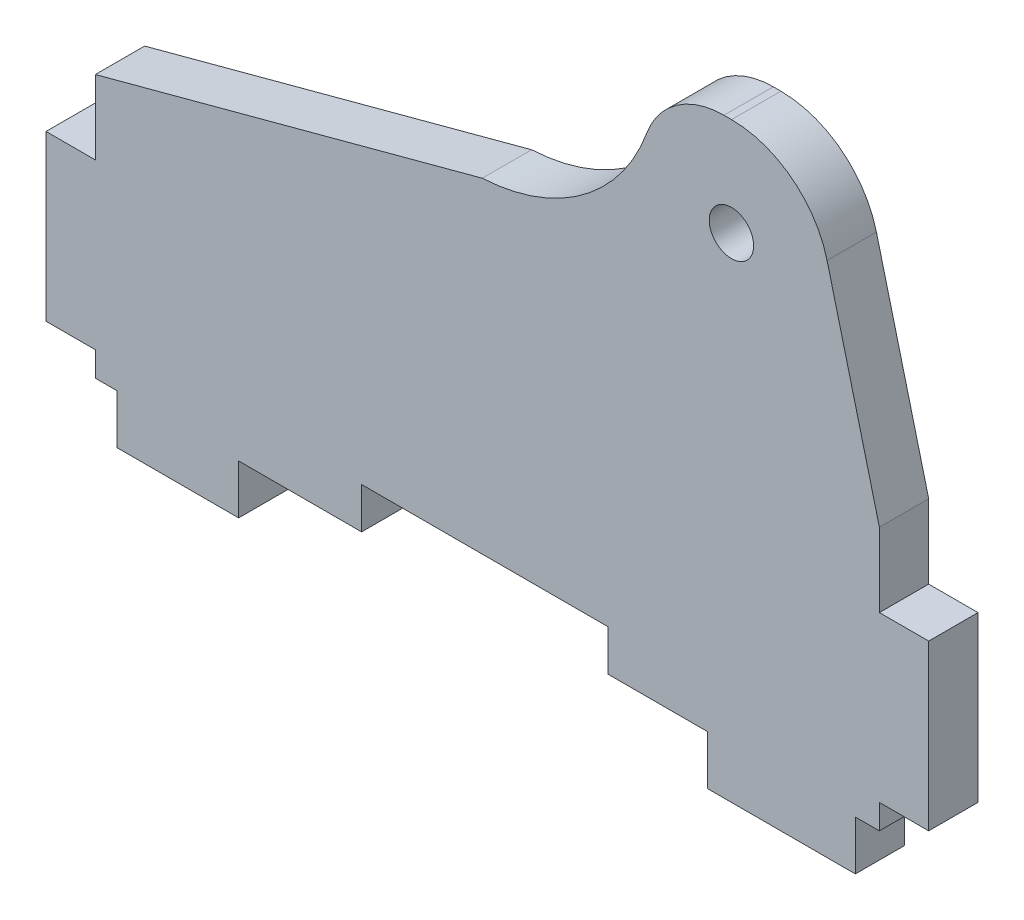
ISO-10303-21;
HEADER;
FILE_DESCRIPTION(('STEP AP214'),'2;1');
FILE_NAME('part.step','',(''),(''),'','','');
FILE_SCHEMA(('AUTOMOTIVE_DESIGN { 1 0 10303 214 1 1 1 1 }'));
ENDSEC;
DATA;
#1=APPLICATION_CONTEXT('core data for automotive mechanical design processes');
#2=APPLICATION_PROTOCOL_DEFINITION('international standard','automotive_design',2000,#1);
#3=PRODUCT_CONTEXT('',#1,'mechanical');
#4=PRODUCT('Part','Part','',(#3));
#5=PRODUCT_RELATED_PRODUCT_CATEGORY('part','',(#4));
#6=PRODUCT_DEFINITION_FORMATION('','',#4);
#7=PRODUCT_DEFINITION_CONTEXT('part definition',#1,'design');
#8=PRODUCT_DEFINITION('design','',#6,#7);
#9=PRODUCT_DEFINITION_SHAPE('','',#8);
#10=(LENGTH_UNIT() NAMED_UNIT(*) SI_UNIT(.MILLI.,.METRE.));
#11=(NAMED_UNIT(*) PLANE_ANGLE_UNIT() SI_UNIT($,.RADIAN.));
#12=(NAMED_UNIT(*) SI_UNIT($,.STERADIAN.) SOLID_ANGLE_UNIT());
#13=UNCERTAINTY_MEASURE_WITH_UNIT(LENGTH_MEASURE(1.E-05),#10,'distance_accuracy_value','');
#14=(GEOMETRIC_REPRESENTATION_CONTEXT(3) GLOBAL_UNCERTAINTY_ASSIGNED_CONTEXT((#13)) GLOBAL_UNIT_ASSIGNED_CONTEXT((#10,
#11,#12)) REPRESENTATION_CONTEXT('',''));
#15=CARTESIAN_POINT('',(0.,0.,0.));
#16=DIRECTION('',(0.,0.,1.));
#17=DIRECTION('',(1.,0.,0.));
#18=AXIS2_PLACEMENT_3D('',#15,#16,#17);
#19=CARTESIAN_POINT('',(41.7056658197043,25.4756,3.));
#20=DIRECTION('',(0.,0.,-1.));
#21=DIRECTION('',(-1.,0.,0.));
#22=AXIS2_PLACEMENT_3D('',#19,#20,#21);
#23=CYLINDRICAL_SURFACE('',#22,5.99999999999999);
#24=CARTESIAN_POINT('',(41.7056658197043,25.4756,0.));
#25=DIRECTION('',(0.,0.,-1.));
#26=DIRECTION('',(-1.,0.,0.));
#27=AXIS2_PLACEMENT_3D('',#24,#25,#26);
#28=CIRCLE('',#27,5.99999999999999);
#29=CARTESIAN_POINT('',(41.7056658197043,31.4756,0.));
#30=VERTEX_POINT('',#29);
#31=CARTESIAN_POINT('',(47.5193202550176,26.9593190120643,0.));
#32=VERTEX_POINT('',#31);
#33=EDGE_CURVE('E260',#30,#32,#28,.T.);
#34=ORIENTED_EDGE('',*,*,#33,.F.);
#35=DIRECTION('',(0.,0.,-1.));
#36=VECTOR('',#35,1.);
#37=CARTESIAN_POINT('',(41.7056658197043,31.4756,3.));
#38=LINE('',#37,#36);
#39=CARTESIAN_POINT('',(41.7056658197043,31.4756,3.));
#40=VERTEX_POINT('',#39);
#41=EDGE_CURVE('E11',#40,#30,#38,.T.);
#42=ORIENTED_EDGE('',*,*,#41,.F.);
#43=CARTESIAN_POINT('',(41.7056658197043,25.4756,3.));
#44=DIRECTION('',(0.,0.,-1.));
#45=DIRECTION('',(-1.,0.,0.));
#46=AXIS2_PLACEMENT_3D('',#43,#44,#45);
#47=CIRCLE('',#46,5.99999999999999);
#48=CARTESIAN_POINT('',(47.5193202550176,26.9593190120643,3.));
#49=VERTEX_POINT('',#48);
#50=EDGE_CURVE('E344',#40,#49,#47,.T.);
#51=ORIENTED_EDGE('',*,*,#50,.T.);
#52=DIRECTION('',(0.,0.,-1.));
#53=VECTOR('',#52,1.);
#54=CARTESIAN_POINT('',(47.5193202550176,26.9593190120643,3.));
#55=LINE('',#54,#53);
#56=EDGE_CURVE('E40',#49,#32,#55,.T.);
#57=ORIENTED_EDGE('',*,*,#56,.T.);
#58=EDGE_LOOP('',(#34,#42,#51,#57));
#59=FACE_BOUND('',#58,.T.);
#60=ADVANCED_FACE('F37',(#59),#23,.T.);
#61=CARTESIAN_POINT('',(41.246222878878,31.4756,3.));
#62=DIRECTION('',(0.,1.,0.));
#63=DIRECTION('',(0.,0.,1.));
#64=AXIS2_PLACEMENT_3D('',#61,#62,#63);
#65=PLANE('',#64);
#66=DIRECTION('',(1.,0.,0.));
#67=VECTOR('',#66,1.);
#68=CARTESIAN_POINT('',(41.246222878878,31.4756,0.));
#69=LINE('',#68,#67);
#70=CARTESIAN_POINT('',(41.246222878878,31.4756,0.));
#71=VERTEX_POINT('',#70);
#72=EDGE_CURVE('E342',#71,#30,#69,.T.);
#73=ORIENTED_EDGE('',*,*,#72,.F.);
#74=DIRECTION('',(0.,0.,-1.));
#75=VECTOR('',#74,1.);
#76=CARTESIAN_POINT('',(41.246222878878,31.4756,3.));
#77=LINE('',#76,#75);
#78=CARTESIAN_POINT('',(41.246222878878,31.4756,3.));
#79=VERTEX_POINT('',#78);
#80=EDGE_CURVE('E46',#79,#71,#77,.T.);
#81=ORIENTED_EDGE('',*,*,#80,.F.);
#82=DIRECTION('',(1.,0.,0.));
#83=VECTOR('',#82,1.);
#84=CARTESIAN_POINT('',(41.246222878878,31.4756,3.));
#85=LINE('',#84,#83);
#86=EDGE_CURVE('E250',#79,#40,#85,.T.);
#87=ORIENTED_EDGE('',*,*,#86,.T.);
#88=ORIENTED_EDGE('',*,*,#41,.T.);
#89=EDGE_LOOP('',(#73,#81,#87,#88));
#90=FACE_BOUND('',#89,.T.);
#91=ADVANCED_FACE('F398',(#90),#65,.T.);
#92=CARTESIAN_POINT('',(41.246222878878,26.4756,3.));
#93=DIRECTION('',(0.,0.,-1.));
#94=DIRECTION('',(-1.,0.,0.));
#95=AXIS2_PLACEMENT_3D('',#92,#93,#94);
#96=CYLINDRICAL_SURFACE('',#95,5.);
#97=CARTESIAN_POINT('',(41.246222878878,26.4756,0.));
#98=DIRECTION('',(0.,0.,-1.));
#99=DIRECTION('',(-1.,0.,0.));
#100=AXIS2_PLACEMENT_3D('',#97,#98,#99);
#101=CIRCLE('',#100,5.);
#102=CARTESIAN_POINT('',(36.5489090063938,28.1888549090451,0.));
#103=VERTEX_POINT('',#102);
#104=EDGE_CURVE('E237',#103,#71,#101,.T.);
#105=ORIENTED_EDGE('',*,*,#104,.F.);
#106=DIRECTION('',(0.,0.,-1.));
#107=VECTOR('',#106,1.);
#108=CARTESIAN_POINT('',(36.5489090063938,28.1888549090451,3.));
#109=LINE('',#108,#107);
#110=CARTESIAN_POINT('',(36.5489090063938,28.1888549090451,3.));
#111=VERTEX_POINT('',#110);
#112=EDGE_CURVE('E232',#111,#103,#109,.T.);
#113=ORIENTED_EDGE('',*,*,#112,.F.);
#114=CARTESIAN_POINT('',(41.246222878878,26.4756,3.));
#115=DIRECTION('',(0.,0.,-1.));
#116=DIRECTION('',(-1.,0.,0.));
#117=AXIS2_PLACEMENT_3D('',#114,#115,#116);
#118=CIRCLE('',#117,5.);
#119=EDGE_CURVE('E235',#111,#79,#118,.T.);
#120=ORIENTED_EDGE('',*,*,#119,.T.);
#121=ORIENTED_EDGE('',*,*,#80,.T.);
#122=EDGE_LOOP('',(#105,#113,#120,#121));
#123=FACE_BOUND('',#122,.T.);
#124=ADVANCED_FACE('F234',(#123),#96,.T.);
#125=CARTESIAN_POINT('',(25.9799527933043,32.0436784543967,3.));
#126=DIRECTION('',(0.,0.,-1.));
#127=DIRECTION('',(-1.,0.,0.));
#128=AXIS2_PLACEMENT_3D('',#125,#126,#127);
#129=CYLINDRICAL_SURFACE('',#128,11.25);
#130=CARTESIAN_POINT('',(25.9799527933043,32.0436784543967,0.));
#131=DIRECTION('',(0.,0.,1.));
#132=DIRECTION('',(1.,0.,0.));
#133=AXIS2_PLACEMENT_3D('',#130,#131,#132);
#134=CIRCLE('',#133,11.25);
#135=CARTESIAN_POINT('',(26.5435430456949,20.807804388379,0.));
#136=VERTEX_POINT('',#135);
#137=EDGE_CURVE('E339',#136,#103,#134,.T.);
#138=ORIENTED_EDGE('',*,*,#137,.F.);
#139=DIRECTION('',(0.,0.,-1.));
#140=VECTOR('',#139,1.);
#141=CARTESIAN_POINT('',(26.5435430456949,20.807804388379,3.));
#142=LINE('',#141,#140);
#143=CARTESIAN_POINT('',(26.5435430456949,20.807804388379,3.));
#144=VERTEX_POINT('',#143);
#145=EDGE_CURVE('E242',#144,#136,#142,.T.);
#146=ORIENTED_EDGE('',*,*,#145,.F.);
#147=CARTESIAN_POINT('',(25.9799527933043,32.0436784543967,3.));
#148=DIRECTION('',(0.,0.,1.));
#149=DIRECTION('',(1.,0.,0.));
#150=AXIS2_PLACEMENT_3D('',#147,#148,#149);
#151=CIRCLE('',#150,11.25);
#152=EDGE_CURVE('E248',#144,#111,#151,.T.);
#153=ORIENTED_EDGE('',*,*,#152,.T.);
#154=ORIENTED_EDGE('',*,*,#112,.T.);
#155=EDGE_LOOP('',(#138,#146,#153,#154));
#156=FACE_BOUND('',#155,.T.);
#157=ADVANCED_FACE('F252',(#156),#129,.F.);
#158=CARTESIAN_POINT('',(3.,14.4996,3.));
#159=DIRECTION('',(-0.258808749652645,0.965928584887741,0.));
#160=DIRECTION('',(-0.965928584887741,-0.258808749652645,0.));
#161=AXIS2_PLACEMENT_3D('',#158,#159,#160);
#162=PLANE('',#161);
#163=DIRECTION('',(0.965928584887741,0.258808749652645,0.));
#164=VECTOR('',#163,1.);
#165=CARTESIAN_POINT('',(3.,14.4996,0.));
#166=LINE('',#165,#164);
#167=CARTESIAN_POINT('',(3.,14.4996,0.));
#168=VERTEX_POINT('',#167);
#169=EDGE_CURVE('E336',#168,#136,#166,.T.);
#170=ORIENTED_EDGE('',*,*,#169,.F.);
#171=DIRECTION('',(0.,0.,-1.));
#172=VECTOR('',#171,1.);
#173=CARTESIAN_POINT('',(3.,14.4996,3.));
#174=LINE('',#173,#172);
#175=CARTESIAN_POINT('',(3.,14.4996,3.));
#176=VERTEX_POINT('',#175);
#177=EDGE_CURVE('E348',#176,#168,#174,.T.);
#178=ORIENTED_EDGE('',*,*,#177,.F.);
#179=DIRECTION('',(0.965928584887741,0.258808749652645,0.));
#180=VECTOR('',#179,1.);
#181=CARTESIAN_POINT('',(3.,14.4996,3.));
#182=LINE('',#181,#180);
#183=EDGE_CURVE('E253',#176,#144,#182,.T.);
#184=ORIENTED_EDGE('',*,*,#183,.T.);
#185=ORIENTED_EDGE('',*,*,#145,.T.);
#186=EDGE_LOOP('',(#170,#178,#184,#185));
#187=FACE_BOUND('',#186,.T.);
#188=ADVANCED_FACE('F411',(#187),#162,.T.);
#189=CARTESIAN_POINT('',(3.,10.0003,3.));
#190=DIRECTION('',(-1.,0.,0.));
#191=DIRECTION('',(0.,0.,1.));
#192=AXIS2_PLACEMENT_3D('',#189,#190,#191);
#193=PLANE('',#192);
#194=DIRECTION('',(0.,1.,0.));
#195=VECTOR('',#194,1.);
#196=CARTESIAN_POINT('',(3.,10.0003,0.));
#197=LINE('',#196,#195);
#198=CARTESIAN_POINT('',(3.,10.0003,0.));
#199=VERTEX_POINT('',#198);
#200=EDGE_CURVE('E333',#199,#168,#197,.T.);
#201=ORIENTED_EDGE('',*,*,#200,.F.);
#202=DIRECTION('',(0.,0.,-1.));
#203=VECTOR('',#202,1.);
#204=CARTESIAN_POINT('',(3.,10.0003,3.));
#205=LINE('',#204,#203);
#206=CARTESIAN_POINT('',(3.,10.0003,3.));
#207=VERTEX_POINT('',#206);
#208=EDGE_CURVE('E350',#207,#199,#205,.T.);
#209=ORIENTED_EDGE('',*,*,#208,.F.);
#210=DIRECTION('',(0.,1.,0.));
#211=VECTOR('',#210,1.);
#212=CARTESIAN_POINT('',(3.,10.0003,3.));
#213=LINE('',#212,#211);
#214=EDGE_CURVE('E255',#207,#176,#213,.T.);
#215=ORIENTED_EDGE('',*,*,#214,.T.);
#216=ORIENTED_EDGE('',*,*,#177,.T.);
#217=EDGE_LOOP('',(#201,#209,#215,#216));
#218=FACE_BOUND('',#217,.T.);
#219=ADVANCED_FACE('F414',(#218),#193,.T.);
#220=CARTESIAN_POINT('',(0.,10.0003,3.));
#221=DIRECTION('',(0.,1.,0.));
#222=DIRECTION('',(0.,0.,1.));
#223=AXIS2_PLACEMENT_3D('',#220,#221,#222);
#224=PLANE('',#223);
#225=DIRECTION('',(1.,0.,0.));
#226=VECTOR('',#225,1.);
#227=CARTESIAN_POINT('',(0.,10.0003,0.));
#228=LINE('',#227,#226);
#229=CARTESIAN_POINT('',(0.,10.0003,0.));
#230=VERTEX_POINT('',#229);
#231=EDGE_CURVE('E330',#230,#199,#228,.T.);
#232=ORIENTED_EDGE('',*,*,#231,.F.);
#233=DIRECTION('',(0.,0.,-1.));
#234=VECTOR('',#233,1.);
#235=CARTESIAN_POINT('',(0.,10.0003,3.));
#236=LINE('',#235,#234);
#237=CARTESIAN_POINT('',(0.,10.0003,3.));
#238=VERTEX_POINT('',#237);
#239=EDGE_CURVE('E352',#238,#230,#236,.T.);
#240=ORIENTED_EDGE('',*,*,#239,.F.);
#241=DIRECTION('',(1.,0.,0.));
#242=VECTOR('',#241,1.);
#243=CARTESIAN_POINT('',(0.,10.0003,3.));
#244=LINE('',#243,#242);
#245=EDGE_CURVE('E596',#238,#207,#244,.T.);
#246=ORIENTED_EDGE('',*,*,#245,.T.);
#247=ORIENTED_EDGE('',*,*,#208,.T.);
#248=EDGE_LOOP('',(#232,#240,#246,#247));
#249=FACE_BOUND('',#248,.T.);
#250=ADVANCED_FACE('F418',(#249),#224,.T.);
#251=CARTESIAN_POINT('',(0.,0.,3.));
#252=DIRECTION('',(-1.,0.,0.));
#253=DIRECTION('',(0.,0.,1.));
#254=AXIS2_PLACEMENT_3D('',#251,#252,#253);
#255=PLANE('',#254);
#256=DIRECTION('',(0.,1.,0.));
#257=VECTOR('',#256,1.);
#258=CARTESIAN_POINT('',(0.,0.,0.));
#259=LINE('',#258,#257);
#260=CARTESIAN_POINT('',(0.,0.,0.));
#261=VERTEX_POINT('',#260);
#262=EDGE_CURVE('E327',#261,#230,#259,.T.);
#263=ORIENTED_EDGE('',*,*,#262,.F.);
#264=DIRECTION('',(0.,0.,-1.));
#265=VECTOR('',#264,1.);
#266=CARTESIAN_POINT('',(0.,0.,3.));
#267=LINE('',#266,#265);
#268=CARTESIAN_POINT('',(0.,0.,3.));
#269=VERTEX_POINT('',#268);
#270=EDGE_CURVE('E354',#269,#261,#267,.T.);
#271=ORIENTED_EDGE('',*,*,#270,.F.);
#272=DIRECTION('',(0.,1.,0.));
#273=VECTOR('',#272,1.);
#274=CARTESIAN_POINT('',(0.,0.,3.));
#275=LINE('',#274,#273);
#276=EDGE_CURVE('E593',#269,#238,#275,.T.);
#277=ORIENTED_EDGE('',*,*,#276,.T.);
#278=ORIENTED_EDGE('',*,*,#239,.T.);
#279=EDGE_LOOP('',(#263,#271,#277,#278));
#280=FACE_BOUND('',#279,.T.);
#281=ADVANCED_FACE('F422',(#280),#255,.T.);
#282=CARTESIAN_POINT('',(3.,0.,3.));
#283=DIRECTION('',(0.,-1.,0.));
#284=DIRECTION('',(0.,0.,-1.));
#285=AXIS2_PLACEMENT_3D('',#282,#283,#284);
#286=PLANE('',#285);
#287=DIRECTION('',(-1.,0.,0.));
#288=VECTOR('',#287,1.);
#289=CARTESIAN_POINT('',(3.,0.,0.));
#290=LINE('',#289,#288);
#291=CARTESIAN_POINT('',(3.,0.,0.));
#292=VERTEX_POINT('',#291);
#293=EDGE_CURVE('E324',#292,#261,#290,.T.);
#294=ORIENTED_EDGE('',*,*,#293,.F.);
#295=DIRECTION('',(0.,0.,-1.));
#296=VECTOR('',#295,1.);
#297=CARTESIAN_POINT('',(3.,0.,3.));
#298=LINE('',#297,#296);
#299=CARTESIAN_POINT('',(3.,0.,3.));
#300=VERTEX_POINT('',#299);
#301=EDGE_CURVE('E356',#300,#292,#298,.T.);
#302=ORIENTED_EDGE('',*,*,#301,.F.);
#303=DIRECTION('',(-1.,0.,0.));
#304=VECTOR('',#303,1.);
#305=CARTESIAN_POINT('',(3.,0.,3.));
#306=LINE('',#305,#304);
#307=EDGE_CURVE('E590',#300,#269,#306,.T.);
#308=ORIENTED_EDGE('',*,*,#307,.T.);
#309=ORIENTED_EDGE('',*,*,#270,.T.);
#310=EDGE_LOOP('',(#294,#302,#308,#309));
#311=FACE_BOUND('',#310,.T.);
#312=ADVANCED_FACE('F426',(#311),#286,.T.);
#313=CARTESIAN_POINT('',(3.,-1.5007,3.));
#314=DIRECTION('',(-1.,0.,0.));
#315=DIRECTION('',(0.,0.,1.));
#316=AXIS2_PLACEMENT_3D('',#313,#314,#315);
#317=PLANE('',#316);
#318=DIRECTION('',(0.,1.,0.));
#319=VECTOR('',#318,1.);
#320=CARTESIAN_POINT('',(3.,-1.5007,0.));
#321=LINE('',#320,#319);
#322=CARTESIAN_POINT('',(3.,-1.5007,0.));
#323=VERTEX_POINT('',#322);
#324=EDGE_CURVE('E321',#323,#292,#321,.T.);
#325=ORIENTED_EDGE('',*,*,#324,.F.);
#326=DIRECTION('',(0.,0.,-1.));
#327=VECTOR('',#326,1.);
#328=CARTESIAN_POINT('',(3.,-1.5007,3.));
#329=LINE('',#328,#327);
#330=CARTESIAN_POINT('',(3.,-1.5007,3.));
#331=VERTEX_POINT('',#330);
#332=EDGE_CURVE('E358',#331,#323,#329,.T.);
#333=ORIENTED_EDGE('',*,*,#332,.F.);
#334=DIRECTION('',(0.,1.,0.));
#335=VECTOR('',#334,1.);
#336=CARTESIAN_POINT('',(3.,-1.5007,3.));
#337=LINE('',#336,#335);
#338=EDGE_CURVE('E587',#331,#300,#337,.T.);
#339=ORIENTED_EDGE('',*,*,#338,.T.);
#340=ORIENTED_EDGE('',*,*,#301,.T.);
#341=EDGE_LOOP('',(#325,#333,#339,#340));
#342=FACE_BOUND('',#341,.T.);
#343=ADVANCED_FACE('F430',(#342),#317,.T.);
#344=CARTESIAN_POINT('',(4.3215,-1.5007,3.));
#345=DIRECTION('',(0.,-1.,0.));
#346=DIRECTION('',(0.,0.,-1.));
#347=AXIS2_PLACEMENT_3D('',#344,#345,#346);
#348=PLANE('',#347);
#349=DIRECTION('',(-1.,0.,0.));
#350=VECTOR('',#349,1.);
#351=CARTESIAN_POINT('',(4.3215,-1.5007,0.));
#352=LINE('',#351,#350);
#353=CARTESIAN_POINT('',(4.3215,-1.5007,0.));
#354=VERTEX_POINT('',#353);
#355=EDGE_CURVE('E318',#354,#323,#352,.T.);
#356=ORIENTED_EDGE('',*,*,#355,.F.);
#357=DIRECTION('',(0.,0.,-1.));
#358=VECTOR('',#357,1.);
#359=CARTESIAN_POINT('',(4.3215,-1.5007,3.));
#360=LINE('',#359,#358);
#361=CARTESIAN_POINT('',(4.3215,-1.5007,3.));
#362=VERTEX_POINT('',#361);
#363=EDGE_CURVE('E360',#362,#354,#360,.T.);
#364=ORIENTED_EDGE('',*,*,#363,.F.);
#365=DIRECTION('',(-1.,0.,0.));
#366=VECTOR('',#365,1.);
#367=CARTESIAN_POINT('',(4.3215,-1.5007,3.));
#368=LINE('',#367,#366);
#369=EDGE_CURVE('E584',#362,#331,#368,.T.);
#370=ORIENTED_EDGE('',*,*,#369,.T.);
#371=ORIENTED_EDGE('',*,*,#332,.T.);
#372=EDGE_LOOP('',(#356,#364,#370,#371));
#373=FACE_BOUND('',#372,.T.);
#374=ADVANCED_FACE('F434',(#373),#348,.T.);
#375=CARTESIAN_POINT('',(4.3215,-4.5007,3.));
#376=DIRECTION('',(-1.,0.,0.));
#377=DIRECTION('',(0.,0.,1.));
#378=AXIS2_PLACEMENT_3D('',#375,#376,#377);
#379=PLANE('',#378);
#380=DIRECTION('',(0.,1.,0.));
#381=VECTOR('',#380,1.);
#382=CARTESIAN_POINT('',(4.3215,-4.5007,0.));
#383=LINE('',#382,#381);
#384=CARTESIAN_POINT('',(4.3215,-4.5007,0.));
#385=VERTEX_POINT('',#384);
#386=EDGE_CURVE('E315',#385,#354,#383,.T.);
#387=ORIENTED_EDGE('',*,*,#386,.F.);
#388=DIRECTION('',(0.,0.,-1.));
#389=VECTOR('',#388,1.);
#390=CARTESIAN_POINT('',(4.3215,-4.5007,3.));
#391=LINE('',#390,#389);
#392=CARTESIAN_POINT('',(4.3215,-4.5007,3.));
#393=VERTEX_POINT('',#392);
#394=EDGE_CURVE('E362',#393,#385,#391,.T.);
#395=ORIENTED_EDGE('',*,*,#394,.F.);
#396=DIRECTION('',(0.,1.,0.));
#397=VECTOR('',#396,1.);
#398=CARTESIAN_POINT('',(4.3215,-4.5007,3.));
#399=LINE('',#398,#397);
#400=EDGE_CURVE('E581',#393,#362,#399,.T.);
#401=ORIENTED_EDGE('',*,*,#400,.T.);
#402=ORIENTED_EDGE('',*,*,#363,.T.);
#403=EDGE_LOOP('',(#387,#395,#401,#402));
#404=FACE_BOUND('',#403,.T.);
#405=ADVANCED_FACE('F438',(#404),#379,.T.);
#406=CARTESIAN_POINT('',(11.7217,-4.5007,3.));
#407=DIRECTION('',(0.,-1.,0.));
#408=DIRECTION('',(0.,0.,-1.));
#409=AXIS2_PLACEMENT_3D('',#406,#407,#408);
#410=PLANE('',#409);
#411=DIRECTION('',(-1.,0.,0.));
#412=VECTOR('',#411,1.);
#413=CARTESIAN_POINT('',(11.7217,-4.5007,0.));
#414=LINE('',#413,#412);
#415=CARTESIAN_POINT('',(11.7217,-4.5007,0.));
#416=VERTEX_POINT('',#415);
#417=EDGE_CURVE('E312',#416,#385,#414,.T.);
#418=ORIENTED_EDGE('',*,*,#417,.F.);
#419=DIRECTION('',(0.,0.,-1.));
#420=VECTOR('',#419,1.);
#421=CARTESIAN_POINT('',(11.7217,-4.5007,3.));
#422=LINE('',#421,#420);
#423=CARTESIAN_POINT('',(11.7217,-4.5007,3.));
#424=VERTEX_POINT('',#423);
#425=EDGE_CURVE('E364',#424,#416,#422,.T.);
#426=ORIENTED_EDGE('',*,*,#425,.F.);
#427=DIRECTION('',(-1.,0.,0.));
#428=VECTOR('',#427,1.);
#429=CARTESIAN_POINT('',(11.7217,-4.5007,3.));
#430=LINE('',#429,#428);
#431=EDGE_CURVE('E578',#424,#393,#430,.T.);
#432=ORIENTED_EDGE('',*,*,#431,.T.);
#433=ORIENTED_EDGE('',*,*,#394,.T.);
#434=EDGE_LOOP('',(#418,#426,#432,#433));
#435=FACE_BOUND('',#434,.T.);
#436=ADVANCED_FACE('F442',(#435),#410,.T.);
#437=CARTESIAN_POINT('',(11.7217,-1.4993,3.));
#438=DIRECTION('',(1.,0.,0.));
#439=DIRECTION('',(0.,1.,0.));
#440=AXIS2_PLACEMENT_3D('',#437,#438,#439);
#441=PLANE('',#440);
#442=DIRECTION('',(0.,-1.,0.));
#443=VECTOR('',#442,1.);
#444=CARTESIAN_POINT('',(11.7217,-1.4993,0.));
#445=LINE('',#444,#443);
#446=CARTESIAN_POINT('',(11.7217,-1.4993,0.));
#447=VERTEX_POINT('',#446);
#448=EDGE_CURVE('E309',#447,#416,#445,.T.);
#449=ORIENTED_EDGE('',*,*,#448,.F.);
#450=DIRECTION('',(0.,0.,-1.));
#451=VECTOR('',#450,1.);
#452=CARTESIAN_POINT('',(11.7217,-1.4993,3.));
#453=LINE('',#452,#451);
#454=CARTESIAN_POINT('',(11.7217,-1.4993,3.));
#455=VERTEX_POINT('',#454);
#456=EDGE_CURVE('E366',#455,#447,#453,.T.);
#457=ORIENTED_EDGE('',*,*,#456,.F.);
#458=DIRECTION('',(0.,-1.,0.));
#459=VECTOR('',#458,1.);
#460=CARTESIAN_POINT('',(11.7217,-1.4993,3.));
#461=LINE('',#460,#459);
#462=EDGE_CURVE('E575',#455,#424,#461,.T.);
#463=ORIENTED_EDGE('',*,*,#462,.T.);
#464=ORIENTED_EDGE('',*,*,#425,.T.);
#465=EDGE_LOOP('',(#449,#457,#463,#464));
#466=FACE_BOUND('',#465,.T.);
#467=ADVANCED_FACE('F446',(#466),#441,.T.);
#468=CARTESIAN_POINT('',(19.2003,-1.4993,3.));
#469=DIRECTION('',(0.,-1.,0.));
#470=DIRECTION('',(0.,0.,-1.));
#471=AXIS2_PLACEMENT_3D('',#468,#469,#470);
#472=PLANE('',#471);
#473=DIRECTION('',(-1.,0.,0.));
#474=VECTOR('',#473,1.);
#475=CARTESIAN_POINT('',(19.2003,-1.4993,0.));
#476=LINE('',#475,#474);
#477=CARTESIAN_POINT('',(19.2003,-1.4993,0.));
#478=VERTEX_POINT('',#477);
#479=EDGE_CURVE('E306',#478,#447,#476,.T.);
#480=ORIENTED_EDGE('',*,*,#479,.F.);
#481=DIRECTION('',(0.,0.,-1.));
#482=VECTOR('',#481,1.);
#483=CARTESIAN_POINT('',(19.2003,-1.4993,3.));
#484=LINE('',#483,#482);
#485=CARTESIAN_POINT('',(19.2003,-1.4993,3.));
#486=VERTEX_POINT('',#485);
#487=EDGE_CURVE('E368',#486,#478,#484,.T.);
#488=ORIENTED_EDGE('',*,*,#487,.F.);
#489=DIRECTION('',(-1.,0.,0.));
#490=VECTOR('',#489,1.);
#491=CARTESIAN_POINT('',(19.2003,-1.4993,3.));
#492=LINE('',#491,#490);
#493=EDGE_CURVE('E572',#486,#455,#492,.T.);
#494=ORIENTED_EDGE('',*,*,#493,.T.);
#495=ORIENTED_EDGE('',*,*,#456,.T.);
#496=EDGE_LOOP('',(#480,#488,#494,#495));
#497=FACE_BOUND('',#496,.T.);
#498=ADVANCED_FACE('F450',(#497),#472,.T.);
#499=CARTESIAN_POINT('',(19.2003,1.0005,3.));
#500=DIRECTION('',(1.,0.,0.));
#501=DIRECTION('',(0.,0.,-1.));
#502=AXIS2_PLACEMENT_3D('',#499,#500,#501);
#503=PLANE('',#502);
#504=DIRECTION('',(0.,-1.,0.));
#505=VECTOR('',#504,1.);
#506=CARTESIAN_POINT('',(19.2003,1.0005,0.));
#507=LINE('',#506,#505);
#508=CARTESIAN_POINT('',(19.2003,1.0005,0.));
#509=VERTEX_POINT('',#508);
#510=EDGE_CURVE('E303',#509,#478,#507,.T.);
#511=ORIENTED_EDGE('',*,*,#510,.F.);
#512=DIRECTION('',(0.,0.,-1.));
#513=VECTOR('',#512,1.);
#514=CARTESIAN_POINT('',(19.2003,1.0005,3.));
#515=LINE('',#514,#513);
#516=CARTESIAN_POINT('',(19.2003,1.0005,3.));
#517=VERTEX_POINT('',#516);
#518=EDGE_CURVE('E370',#517,#509,#515,.T.);
#519=ORIENTED_EDGE('',*,*,#518,.F.);
#520=DIRECTION('',(0.,-1.,0.));
#521=VECTOR('',#520,1.);
#522=CARTESIAN_POINT('',(19.2003,1.0005,3.));
#523=LINE('',#522,#521);
#524=EDGE_CURVE('E569',#517,#486,#523,.T.);
#525=ORIENTED_EDGE('',*,*,#524,.T.);
#526=ORIENTED_EDGE('',*,*,#487,.T.);
#527=EDGE_LOOP('',(#511,#519,#525,#526));
#528=FACE_BOUND('',#527,.T.);
#529=ADVANCED_FACE('F454',(#528),#503,.T.);
#530=CARTESIAN_POINT('',(34.2002,1.0005,3.));
#531=DIRECTION('',(0.,-1.,0.));
#532=DIRECTION('',(0.,0.,-1.));
#533=AXIS2_PLACEMENT_3D('',#530,#531,#532);
#534=PLANE('',#533);
#535=DIRECTION('',(-1.,0.,0.));
#536=VECTOR('',#535,1.);
#537=CARTESIAN_POINT('',(34.2002,1.0005,0.));
#538=LINE('',#537,#536);
#539=CARTESIAN_POINT('',(34.2002,1.0005,0.));
#540=VERTEX_POINT('',#539);
#541=EDGE_CURVE('E300',#540,#509,#538,.T.);
#542=ORIENTED_EDGE('',*,*,#541,.F.);
#543=DIRECTION('',(0.,0.,-1.));
#544=VECTOR('',#543,1.);
#545=CARTESIAN_POINT('',(34.2002,1.0005,3.));
#546=LINE('',#545,#544);
#547=CARTESIAN_POINT('',(34.2002,1.0005,3.));
#548=VERTEX_POINT('',#547);
#549=EDGE_CURVE('E372',#548,#540,#546,.T.);
#550=ORIENTED_EDGE('',*,*,#549,.F.);
#551=DIRECTION('',(-1.,0.,0.));
#552=VECTOR('',#551,1.);
#553=CARTESIAN_POINT('',(34.2002,1.0005,3.));
#554=LINE('',#553,#552);
#555=EDGE_CURVE('E566',#548,#517,#554,.T.);
#556=ORIENTED_EDGE('',*,*,#555,.T.);
#557=ORIENTED_EDGE('',*,*,#518,.T.);
#558=EDGE_LOOP('',(#542,#550,#556,#557));
#559=FACE_BOUND('',#558,.T.);
#560=ADVANCED_FACE('F458',(#559),#534,.T.);
#561=CARTESIAN_POINT('',(34.2002,-1.4993,3.));
#562=DIRECTION('',(-1.,0.,0.));
#563=DIRECTION('',(0.,0.,1.));
#564=AXIS2_PLACEMENT_3D('',#561,#562,#563);
#565=PLANE('',#564);
#566=DIRECTION('',(0.,1.,0.));
#567=VECTOR('',#566,1.);
#568=CARTESIAN_POINT('',(34.2002,-1.4993,0.));
#569=LINE('',#568,#567);
#570=CARTESIAN_POINT('',(34.2002,-1.4993,0.));
#571=VERTEX_POINT('',#570);
#572=EDGE_CURVE('E297',#571,#540,#569,.T.);
#573=ORIENTED_EDGE('',*,*,#572,.F.);
#574=DIRECTION('',(0.,0.,-1.));
#575=VECTOR('',#574,1.);
#576=CARTESIAN_POINT('',(34.2002,-1.4993,3.));
#577=LINE('',#576,#575);
#578=CARTESIAN_POINT('',(34.2002,-1.4993,3.));
#579=VERTEX_POINT('',#578);
#580=EDGE_CURVE('E374',#579,#571,#577,.T.);
#581=ORIENTED_EDGE('',*,*,#580,.F.);
#582=DIRECTION('',(0.,1.,0.));
#583=VECTOR('',#582,1.);
#584=CARTESIAN_POINT('',(34.2002,-1.4993,3.));
#585=LINE('',#584,#583);
#586=EDGE_CURVE('E563',#579,#548,#585,.T.);
#587=ORIENTED_EDGE('',*,*,#586,.T.);
#588=ORIENTED_EDGE('',*,*,#549,.T.);
#589=EDGE_LOOP('',(#573,#581,#587,#588));
#590=FACE_BOUND('',#589,.T.);
#591=ADVANCED_FACE('F462',(#590),#565,.T.);
#592=CARTESIAN_POINT('',(40.2392,-1.4993,3.));
#593=DIRECTION('',(0.,-1.,0.));
#594=DIRECTION('',(0.,0.,-1.));
#595=AXIS2_PLACEMENT_3D('',#592,#593,#594);
#596=PLANE('',#595);
#597=DIRECTION('',(-1.,0.,0.));
#598=VECTOR('',#597,1.);
#599=CARTESIAN_POINT('',(40.2392,-1.4993,0.));
#600=LINE('',#599,#598);
#601=CARTESIAN_POINT('',(40.2392,-1.4993,0.));
#602=VERTEX_POINT('',#601);
#603=EDGE_CURVE('E294',#602,#571,#600,.T.);
#604=ORIENTED_EDGE('',*,*,#603,.F.);
#605=DIRECTION('',(0.,0.,-1.));
#606=VECTOR('',#605,1.);
#607=CARTESIAN_POINT('',(40.2392,-1.4993,3.));
#608=LINE('',#607,#606);
#609=CARTESIAN_POINT('',(40.2392,-1.4993,3.));
#610=VERTEX_POINT('',#609);
#611=EDGE_CURVE('E376',#610,#602,#608,.T.);
#612=ORIENTED_EDGE('',*,*,#611,.F.);
#613=DIRECTION('',(-1.,0.,0.));
#614=VECTOR('',#613,1.);
#615=CARTESIAN_POINT('',(40.2392,-1.4993,3.));
#616=LINE('',#615,#614);
#617=EDGE_CURVE('E560',#610,#579,#616,.T.);
#618=ORIENTED_EDGE('',*,*,#617,.T.);
#619=ORIENTED_EDGE('',*,*,#580,.T.);
#620=EDGE_LOOP('',(#604,#612,#618,#619));
#621=FACE_BOUND('',#620,.T.);
#622=ADVANCED_FACE('F466',(#621),#596,.T.);
#623=CARTESIAN_POINT('',(40.2392,-4.5007,3.));
#624=DIRECTION('',(-1.,0.,0.));
#625=DIRECTION('',(0.,0.,1.));
#626=AXIS2_PLACEMENT_3D('',#623,#624,#625);
#627=PLANE('',#626);
#628=DIRECTION('',(0.,1.,0.));
#629=VECTOR('',#628,1.);
#630=CARTESIAN_POINT('',(40.2392,-4.5007,0.));
#631=LINE('',#630,#629);
#632=CARTESIAN_POINT('',(40.2392,-4.5007,0.));
#633=VERTEX_POINT('',#632);
#634=EDGE_CURVE('E291',#633,#602,#631,.T.);
#635=ORIENTED_EDGE('',*,*,#634,.F.);
#636=DIRECTION('',(0.,0.,-1.));
#637=VECTOR('',#636,1.);
#638=CARTESIAN_POINT('',(40.2392,-4.5007,3.));
#639=LINE('',#638,#637);
#640=CARTESIAN_POINT('',(40.2392,-4.5007,3.));
#641=VERTEX_POINT('',#640);
#642=EDGE_CURVE('E378',#641,#633,#639,.T.);
#643=ORIENTED_EDGE('',*,*,#642,.F.);
#644=DIRECTION('',(0.,1.,0.));
#645=VECTOR('',#644,1.);
#646=CARTESIAN_POINT('',(40.2392,-4.5007,3.));
#647=LINE('',#646,#645);
#648=EDGE_CURVE('E557',#641,#610,#647,.T.);
#649=ORIENTED_EDGE('',*,*,#648,.T.);
#650=ORIENTED_EDGE('',*,*,#611,.T.);
#651=EDGE_LOOP('',(#635,#643,#649,#650));
#652=FACE_BOUND('',#651,.T.);
#653=ADVANCED_FACE('F470',(#652),#627,.T.);
#654=CARTESIAN_POINT('',(49.2382,-4.5007,3.));
#655=DIRECTION('',(0.,-1.,0.));
#656=DIRECTION('',(0.,0.,-1.));
#657=AXIS2_PLACEMENT_3D('',#654,#655,#656);
#658=PLANE('',#657);
#659=DIRECTION('',(-1.,0.,0.));
#660=VECTOR('',#659,1.);
#661=CARTESIAN_POINT('',(49.2382,-4.5007,0.));
#662=LINE('',#661,#660);
#663=CARTESIAN_POINT('',(49.2382,-4.5007,0.));
#664=VERTEX_POINT('',#663);
#665=EDGE_CURVE('E288',#664,#633,#662,.T.);
#666=ORIENTED_EDGE('',*,*,#665,.F.);
#667=DIRECTION('',(0.,0.,-1.));
#668=VECTOR('',#667,1.);
#669=CARTESIAN_POINT('',(49.2382,-4.5007,3.));
#670=LINE('',#669,#668);
#671=CARTESIAN_POINT('',(49.2382,-4.5007,3.));
#672=VERTEX_POINT('',#671);
#673=EDGE_CURVE('E380',#672,#664,#670,.T.);
#674=ORIENTED_EDGE('',*,*,#673,.F.);
#675=DIRECTION('',(-1.,0.,0.));
#676=VECTOR('',#675,1.);
#677=CARTESIAN_POINT('',(49.2382,-4.5007,3.));
#678=LINE('',#677,#676);
#679=EDGE_CURVE('E554',#672,#641,#678,.T.);
#680=ORIENTED_EDGE('',*,*,#679,.T.);
#681=ORIENTED_EDGE('',*,*,#642,.T.);
#682=EDGE_LOOP('',(#666,#674,#680,#681));
#683=FACE_BOUND('',#682,.T.);
#684=ADVANCED_FACE('F474',(#683),#658,.T.);
#685=CARTESIAN_POINT('',(49.2382,-1.5007,3.));
#686=DIRECTION('',(1.,0.,0.));
#687=DIRECTION('',(0.,0.,-1.));
#688=AXIS2_PLACEMENT_3D('',#685,#686,#687);
#689=PLANE('',#688);
#690=DIRECTION('',(0.,-1.,0.));
#691=VECTOR('',#690,1.);
#692=CARTESIAN_POINT('',(49.2382,-1.5007,0.));
#693=LINE('',#692,#691);
#694=CARTESIAN_POINT('',(49.2382,-1.5007,0.));
#695=VERTEX_POINT('',#694);
#696=EDGE_CURVE('E285',#695,#664,#693,.T.);
#697=ORIENTED_EDGE('',*,*,#696,.F.);
#698=DIRECTION('',(0.,0.,-1.));
#699=VECTOR('',#698,1.);
#700=CARTESIAN_POINT('',(49.2382,-1.5007,3.));
#701=LINE('',#700,#699);
#702=CARTESIAN_POINT('',(49.2382,-1.5007,3.));
#703=VERTEX_POINT('',#702);
#704=EDGE_CURVE('E382',#703,#695,#701,.T.);
#705=ORIENTED_EDGE('',*,*,#704,.F.);
#706=DIRECTION('',(0.,-1.,0.));
#707=VECTOR('',#706,1.);
#708=CARTESIAN_POINT('',(49.2382,-1.5007,3.));
#709=LINE('',#708,#707);
#710=EDGE_CURVE('E551',#703,#672,#709,.T.);
#711=ORIENTED_EDGE('',*,*,#710,.T.);
#712=ORIENTED_EDGE('',*,*,#673,.T.);
#713=EDGE_LOOP('',(#697,#705,#711,#712));
#714=FACE_BOUND('',#713,.T.);
#715=ADVANCED_FACE('F478',(#714),#689,.T.);
#716=CARTESIAN_POINT('',(50.6992,-1.5007,3.));
#717=DIRECTION('',(0.,-1.,0.));
#718=DIRECTION('',(0.,0.,-1.));
#719=AXIS2_PLACEMENT_3D('',#716,#717,#718);
#720=PLANE('',#719);
#721=DIRECTION('',(-1.,0.,0.));
#722=VECTOR('',#721,1.);
#723=CARTESIAN_POINT('',(50.6992,-1.5007,0.));
#724=LINE('',#723,#722);
#725=CARTESIAN_POINT('',(50.6992,-1.5007,0.));
#726=VERTEX_POINT('',#725);
#727=EDGE_CURVE('E282',#726,#695,#724,.T.);
#728=ORIENTED_EDGE('',*,*,#727,.F.);
#729=DIRECTION('',(0.,0.,-1.));
#730=VECTOR('',#729,1.);
#731=CARTESIAN_POINT('',(50.6992,-1.5007,3.));
#732=LINE('',#731,#730);
#733=CARTESIAN_POINT('',(50.6992,-1.5007,3.));
#734=VERTEX_POINT('',#733);
#735=EDGE_CURVE('E384',#734,#726,#732,.T.);
#736=ORIENTED_EDGE('',*,*,#735,.F.);
#737=DIRECTION('',(-1.,0.,0.));
#738=VECTOR('',#737,1.);
#739=CARTESIAN_POINT('',(50.6992,-1.5007,3.));
#740=LINE('',#739,#738);
#741=EDGE_CURVE('E548',#734,#703,#740,.T.);
#742=ORIENTED_EDGE('',*,*,#741,.T.);
#743=ORIENTED_EDGE('',*,*,#704,.T.);
#744=EDGE_LOOP('',(#728,#736,#742,#743));
#745=FACE_BOUND('',#744,.T.);
#746=ADVANCED_FACE('F482',(#745),#720,.T.);
#747=CARTESIAN_POINT('',(50.6992,0.,3.));
#748=DIRECTION('',(1.,0.,0.));
#749=DIRECTION('',(0.,0.,-1.));
#750=AXIS2_PLACEMENT_3D('',#747,#748,#749);
#751=PLANE('',#750);
#752=DIRECTION('',(0.,-1.,0.));
#753=VECTOR('',#752,1.);
#754=CARTESIAN_POINT('',(50.6992,0.,0.));
#755=LINE('',#754,#753);
#756=CARTESIAN_POINT('',(50.6992,0.,0.));
#757=VERTEX_POINT('',#756);
#758=EDGE_CURVE('E279',#757,#726,#755,.T.);
#759=ORIENTED_EDGE('',*,*,#758,.F.);
#760=DIRECTION('',(0.,0.,-1.));
#761=VECTOR('',#760,1.);
#762=CARTESIAN_POINT('',(50.6992,0.,3.));
#763=LINE('',#762,#761);
#764=CARTESIAN_POINT('',(50.6992,0.,3.));
#765=VERTEX_POINT('',#764);
#766=EDGE_CURVE('E386',#765,#757,#763,.T.);
#767=ORIENTED_EDGE('',*,*,#766,.F.);
#768=DIRECTION('',(0.,-1.,0.));
#769=VECTOR('',#768,1.);
#770=CARTESIAN_POINT('',(50.6992,0.,3.));
#771=LINE('',#770,#769);
#772=EDGE_CURVE('E545',#765,#734,#771,.T.);
#773=ORIENTED_EDGE('',*,*,#772,.T.);
#774=ORIENTED_EDGE('',*,*,#735,.T.);
#775=EDGE_LOOP('',(#759,#767,#773,#774));
#776=FACE_BOUND('',#775,.T.);
#777=ADVANCED_FACE('F486',(#776),#751,.T.);
#778=CARTESIAN_POINT('',(53.6992,0.,3.));
#779=DIRECTION('',(0.,-1.,0.));
#780=DIRECTION('',(1.,0.,0.));
#781=AXIS2_PLACEMENT_3D('',#778,#779,#780);
#782=PLANE('',#781);
#783=DIRECTION('',(-1.,0.,0.));
#784=VECTOR('',#783,1.);
#785=CARTESIAN_POINT('',(53.6992,0.,0.));
#786=LINE('',#785,#784);
#787=CARTESIAN_POINT('',(53.6992,0.,0.));
#788=VERTEX_POINT('',#787);
#789=EDGE_CURVE('E276',#788,#757,#786,.T.);
#790=ORIENTED_EDGE('',*,*,#789,.F.);
#791=DIRECTION('',(0.,0.,-1.));
#792=VECTOR('',#791,1.);
#793=CARTESIAN_POINT('',(53.6992,0.,3.));
#794=LINE('',#793,#792);
#795=CARTESIAN_POINT('',(53.6992,0.,3.));
#796=VERTEX_POINT('',#795);
#797=EDGE_CURVE('E388',#796,#788,#794,.T.);
#798=ORIENTED_EDGE('',*,*,#797,.F.);
#799=DIRECTION('',(-1.,0.,0.));
#800=VECTOR('',#799,1.);
#801=CARTESIAN_POINT('',(53.6992,0.,3.));
#802=LINE('',#801,#800);
#803=EDGE_CURVE('E542',#796,#765,#802,.T.);
#804=ORIENTED_EDGE('',*,*,#803,.T.);
#805=ORIENTED_EDGE('',*,*,#766,.T.);
#806=EDGE_LOOP('',(#790,#798,#804,#805));
#807=FACE_BOUND('',#806,.T.);
#808=ADVANCED_FACE('F490',(#807),#782,.T.);
#809=CARTESIAN_POINT('',(53.6992,10.0003,3.));
#810=DIRECTION('',(1.,0.,0.));
#811=DIRECTION('',(0.,0.,-1.));
#812=AXIS2_PLACEMENT_3D('',#809,#810,#811);
#813=PLANE('',#812);
#814=DIRECTION('',(0.,-1.,0.));
#815=VECTOR('',#814,1.);
#816=CARTESIAN_POINT('',(53.6992,10.0003,0.));
#817=LINE('',#816,#815);
#818=CARTESIAN_POINT('',(53.6992,10.0003,0.));
#819=VERTEX_POINT('',#818);
#820=EDGE_CURVE('E273',#819,#788,#817,.T.);
#821=ORIENTED_EDGE('',*,*,#820,.F.);
#822=DIRECTION('',(0.,0.,-1.));
#823=VECTOR('',#822,1.);
#824=CARTESIAN_POINT('',(53.6992,10.0003,3.));
#825=LINE('',#824,#823);
#826=CARTESIAN_POINT('',(53.6992,10.0003,3.));
#827=VERTEX_POINT('',#826);
#828=EDGE_CURVE('E390',#827,#819,#825,.T.);
#829=ORIENTED_EDGE('',*,*,#828,.F.);
#830=DIRECTION('',(0.,-1.,0.));
#831=VECTOR('',#830,1.);
#832=CARTESIAN_POINT('',(53.6992,10.0003,3.));
#833=LINE('',#832,#831);
#834=EDGE_CURVE('E539',#827,#796,#833,.T.);
#835=ORIENTED_EDGE('',*,*,#834,.T.);
#836=ORIENTED_EDGE('',*,*,#797,.T.);
#837=EDGE_LOOP('',(#821,#829,#835,#836));
#838=FACE_BOUND('',#837,.T.);
#839=ADVANCED_FACE('F494',(#838),#813,.T.);
#840=CARTESIAN_POINT('',(50.6992,10.0003,3.));
#841=DIRECTION('',(0.,1.,0.));
#842=DIRECTION('',(0.,0.,1.));
#843=AXIS2_PLACEMENT_3D('',#840,#841,#842);
#844=PLANE('',#843);
#845=DIRECTION('',(1.,0.,0.));
#846=VECTOR('',#845,1.);
#847=CARTESIAN_POINT('',(50.6992,10.0003,0.));
#848=LINE('',#847,#846);
#849=CARTESIAN_POINT('',(50.6992,10.0003,0.));
#850=VERTEX_POINT('',#849);
#851=EDGE_CURVE('E270',#850,#819,#848,.T.);
#852=ORIENTED_EDGE('',*,*,#851,.F.);
#853=DIRECTION('',(0.,0.,-1.));
#854=VECTOR('',#853,1.);
#855=CARTESIAN_POINT('',(50.6992,10.0003,3.));
#856=LINE('',#855,#854);
#857=CARTESIAN_POINT('',(50.6992,10.0003,3.));
#858=VERTEX_POINT('',#857);
#859=EDGE_CURVE('E392',#858,#850,#856,.T.);
#860=ORIENTED_EDGE('',*,*,#859,.F.);
#861=DIRECTION('',(1.,0.,0.));
#862=VECTOR('',#861,1.);
#863=CARTESIAN_POINT('',(50.6992,10.0003,3.));
#864=LINE('',#863,#862);
#865=EDGE_CURVE('E536',#858,#827,#864,.T.);
#866=ORIENTED_EDGE('',*,*,#865,.T.);
#867=ORIENTED_EDGE('',*,*,#828,.T.);
#868=EDGE_LOOP('',(#852,#860,#866,#867));
#869=FACE_BOUND('',#868,.T.);
#870=ADVANCED_FACE('F498',(#869),#844,.T.);
#871=CARTESIAN_POINT('',(50.6992,14.4996,3.));
#872=DIRECTION('',(1.,0.,0.));
#873=DIRECTION('',(0.,1.,0.));
#874=AXIS2_PLACEMENT_3D('',#871,#872,#873);
#875=PLANE('',#874);
#876=DIRECTION('',(0.,-1.,0.));
#877=VECTOR('',#876,1.);
#878=CARTESIAN_POINT('',(50.6992,14.4996,0.));
#879=LINE('',#878,#877);
#880=CARTESIAN_POINT('',(50.6992,14.4996,0.));
#881=VERTEX_POINT('',#880);
#882=EDGE_CURVE('E267',#881,#850,#879,.T.);
#883=ORIENTED_EDGE('',*,*,#882,.F.);
#884=DIRECTION('',(0.,0.,-1.));
#885=VECTOR('',#884,1.);
#886=CARTESIAN_POINT('',(50.6992,14.4996,3.));
#887=LINE('',#886,#885);
#888=CARTESIAN_POINT('',(50.6992,14.4996,3.));
#889=VERTEX_POINT('',#888);
#890=EDGE_CURVE('E393',#889,#881,#887,.T.);
#891=ORIENTED_EDGE('',*,*,#890,.F.);
#892=DIRECTION('',(0.,-1.,0.));
#893=VECTOR('',#892,1.);
#894=CARTESIAN_POINT('',(50.6992,14.4996,3.));
#895=LINE('',#894,#893);
#896=EDGE_CURVE('E533',#889,#858,#895,.T.);
#897=ORIENTED_EDGE('',*,*,#896,.T.);
#898=ORIENTED_EDGE('',*,*,#859,.T.);
#899=EDGE_LOOP('',(#883,#891,#897,#898));
#900=FACE_BOUND('',#899,.T.);
#901=ADVANCED_FACE('F502',(#900),#875,.T.);
#902=CARTESIAN_POINT('',(47.5193202550176,26.9593190120643,3.));
#903=DIRECTION('',(0.96894240588556,0.247286502010729,0.));
#904=DIRECTION('',(-0.247286502010729,0.96894240588556,0.));
#905=AXIS2_PLACEMENT_3D('',#902,#903,#904);
#906=PLANE('',#905);
#907=DIRECTION('',(0.247286502010729,-0.96894240588556,0.));
#908=VECTOR('',#907,1.);
#909=CARTESIAN_POINT('',(47.5193202550176,26.9593190120643,0.));
#910=LINE('',#909,#908);
#911=EDGE_CURVE('E263',#32,#881,#910,.T.);
#912=ORIENTED_EDGE('',*,*,#911,.F.);
#913=ORIENTED_EDGE('',*,*,#56,.F.);
#914=DIRECTION('',(0.247286502010729,-0.96894240588556,0.));
#915=VECTOR('',#914,1.);
#916=CARTESIAN_POINT('',(47.5193202550176,26.9593190120643,3.));
#917=LINE('',#916,#915);
#918=EDGE_CURVE('E531',#49,#889,#917,.T.);
#919=ORIENTED_EDGE('',*,*,#918,.T.);
#920=ORIENTED_EDGE('',*,*,#890,.T.);
#921=EDGE_LOOP('',(#912,#913,#919,#920));
#922=FACE_BOUND('',#921,.T.);
#923=ADVANCED_FACE('F395',(#922),#906,.T.);
#924=CARTESIAN_POINT('',(41.7056658197043,25.4756,3.));
#925=DIRECTION('',(0.,0.,-1.));
#926=DIRECTION('',(-1.,0.,0.));
#927=AXIS2_PLACEMENT_3D('',#924,#925,#926);
#928=PLANE('',#927);
#929=CARTESIAN_POINT('',(41.6992,25.49975,3.));
#930=DIRECTION('',(0.,0.,-1.));
#931=DIRECTION('',(1.,0.,0.));
#932=AXIS2_PLACEMENT_3D('',#929,#930,#931);
#933=CIRCLE('',#932,1.35);
#934=CARTESIAN_POINT('',(43.0492,25.49975,3.));
#935=VERTEX_POINT('',#934);
#936=EDGE_CURVE('E264',#935,#935,#933,.T.);
#937=ORIENTED_EDGE('',*,*,#936,.T.);
#938=EDGE_LOOP('',(#937));
#939=FACE_BOUND('',#938,.T.);
#940=ORIENTED_EDGE('',*,*,#50,.F.);
#941=ORIENTED_EDGE('',*,*,#86,.F.);
#942=ORIENTED_EDGE('',*,*,#119,.F.);
#943=ORIENTED_EDGE('',*,*,#152,.F.);
#944=ORIENTED_EDGE('',*,*,#183,.F.);
#945=ORIENTED_EDGE('',*,*,#214,.F.);
#946=ORIENTED_EDGE('',*,*,#245,.F.);
#947=ORIENTED_EDGE('',*,*,#276,.F.);
#948=ORIENTED_EDGE('',*,*,#307,.F.);
#949=ORIENTED_EDGE('',*,*,#338,.F.);
#950=ORIENTED_EDGE('',*,*,#369,.F.);
#951=ORIENTED_EDGE('',*,*,#400,.F.);
#952=ORIENTED_EDGE('',*,*,#431,.F.);
#953=ORIENTED_EDGE('',*,*,#462,.F.);
#954=ORIENTED_EDGE('',*,*,#493,.F.);
#955=ORIENTED_EDGE('',*,*,#524,.F.);
#956=ORIENTED_EDGE('',*,*,#555,.F.);
#957=ORIENTED_EDGE('',*,*,#586,.F.);
#958=ORIENTED_EDGE('',*,*,#617,.F.);
#959=ORIENTED_EDGE('',*,*,#648,.F.);
#960=ORIENTED_EDGE('',*,*,#679,.F.);
#961=ORIENTED_EDGE('',*,*,#710,.F.);
#962=ORIENTED_EDGE('',*,*,#741,.F.);
#963=ORIENTED_EDGE('',*,*,#772,.F.);
#964=ORIENTED_EDGE('',*,*,#803,.F.);
#965=ORIENTED_EDGE('',*,*,#834,.F.);
#966=ORIENTED_EDGE('',*,*,#865,.F.);
#967=ORIENTED_EDGE('',*,*,#896,.F.);
#968=ORIENTED_EDGE('',*,*,#918,.F.);
#969=EDGE_LOOP('',(#940,#941,#942,#943,#944,#945,#946,#947,#948,#949,#950,#951,#952,#953,#954,
#955,#956,#957,#958,#959,#960,#961,#962,#963,#964,#965,#966,#967,#968));
#970=FACE_BOUND('',#969,.T.);
#971=ADVANCED_FACE('F246',(#939,#970),#928,.F.);
#972=CARTESIAN_POINT('',(41.7056658197043,25.4756,0.));
#973=DIRECTION('',(0.,0.,-1.));
#974=DIRECTION('',(-1.,0.,0.));
#975=AXIS2_PLACEMENT_3D('',#972,#973,#974);
#976=PLANE('',#975);
#977=CARTESIAN_POINT('',(41.6992,25.49975,0.));
#978=DIRECTION('',(0.,0.,-1.));
#979=DIRECTION('',(1.,0.,0.));
#980=AXIS2_PLACEMENT_3D('',#977,#978,#979);
#981=CIRCLE('',#980,1.35);
#982=CARTESIAN_POINT('',(43.0492,25.49975,0.));
#983=VERTEX_POINT('',#982);
#984=EDGE_CURVE('E526',#983,#983,#981,.T.);
#985=ORIENTED_EDGE('',*,*,#984,.F.);
#986=EDGE_LOOP('',(#985));
#987=FACE_BOUND('',#986,.T.);
#988=ORIENTED_EDGE('',*,*,#33,.T.);
#989=ORIENTED_EDGE('',*,*,#911,.T.);
#990=ORIENTED_EDGE('',*,*,#882,.T.);
#991=ORIENTED_EDGE('',*,*,#851,.T.);
#992=ORIENTED_EDGE('',*,*,#820,.T.);
#993=ORIENTED_EDGE('',*,*,#789,.T.);
#994=ORIENTED_EDGE('',*,*,#758,.T.);
#995=ORIENTED_EDGE('',*,*,#727,.T.);
#996=ORIENTED_EDGE('',*,*,#696,.T.);
#997=ORIENTED_EDGE('',*,*,#665,.T.);
#998=ORIENTED_EDGE('',*,*,#634,.T.);
#999=ORIENTED_EDGE('',*,*,#603,.T.);
#1000=ORIENTED_EDGE('',*,*,#572,.T.);
#1001=ORIENTED_EDGE('',*,*,#541,.T.);
#1002=ORIENTED_EDGE('',*,*,#510,.T.);
#1003=ORIENTED_EDGE('',*,*,#479,.T.);
#1004=ORIENTED_EDGE('',*,*,#448,.T.);
#1005=ORIENTED_EDGE('',*,*,#417,.T.);
#1006=ORIENTED_EDGE('',*,*,#386,.T.);
#1007=ORIENTED_EDGE('',*,*,#355,.T.);
#1008=ORIENTED_EDGE('',*,*,#324,.T.);
#1009=ORIENTED_EDGE('',*,*,#293,.T.);
#1010=ORIENTED_EDGE('',*,*,#262,.T.);
#1011=ORIENTED_EDGE('',*,*,#231,.T.);
#1012=ORIENTED_EDGE('',*,*,#200,.T.);
#1013=ORIENTED_EDGE('',*,*,#169,.T.);
#1014=ORIENTED_EDGE('',*,*,#137,.T.);
#1015=ORIENTED_EDGE('',*,*,#104,.T.);
#1016=ORIENTED_EDGE('',*,*,#72,.T.);
#1017=EDGE_LOOP('',(#988,#989,#990,#991,#992,#993,#994,#995,#996,#997,#998,#999,#1000,#1001,
#1002,#1003,#1004,#1005,#1006,#1007,#1008,#1009,#1010,#1011,#1012,#1013,#1014,#1015,#1016));
#1018=FACE_BOUND('',#1017,.T.);
#1019=ADVANCED_FACE('F397',(#987,#1018),#976,.T.);
#1020=CARTESIAN_POINT('',(41.6992,25.49975,3.));
#1021=DIRECTION('',(0.,0.,-1.));
#1022=DIRECTION('',(-1.,0.,0.));
#1023=AXIS2_PLACEMENT_3D('',#1020,#1021,#1022);
#1024=CYLINDRICAL_SURFACE('',#1023,1.35);
#1025=ORIENTED_EDGE('',*,*,#936,.F.);
#1026=EDGE_LOOP('',(#1025));
#1027=FACE_BOUND('',#1026,.T.);
#1028=ORIENTED_EDGE('',*,*,#984,.T.);
#1029=EDGE_LOOP('',(#1028));
#1030=FACE_BOUND('',#1029,.T.);
#1031=ADVANCED_FACE('F514',(#1027,#1030),#1024,.F.);
#1032=CLOSED_SHELL('',(#60,#91,#124,#157,#188,#219,#250,#281,#312,#343,#374,#405,#436,#467,#498,
#529,#560,#591,#622,#653,#684,#715,#746,#777,#808,#839,#870,#901,#923,#971,#1019,#1031));
#1033=MANIFOLD_SOLID_BREP('B2',#1032);
#1034=ADVANCED_BREP_SHAPE_REPRESENTATION('',(#18,#1033),#14);
#1035=SHAPE_DEFINITION_REPRESENTATION(#9,#1034);
ENDSEC;
END-ISO-10303-21;
